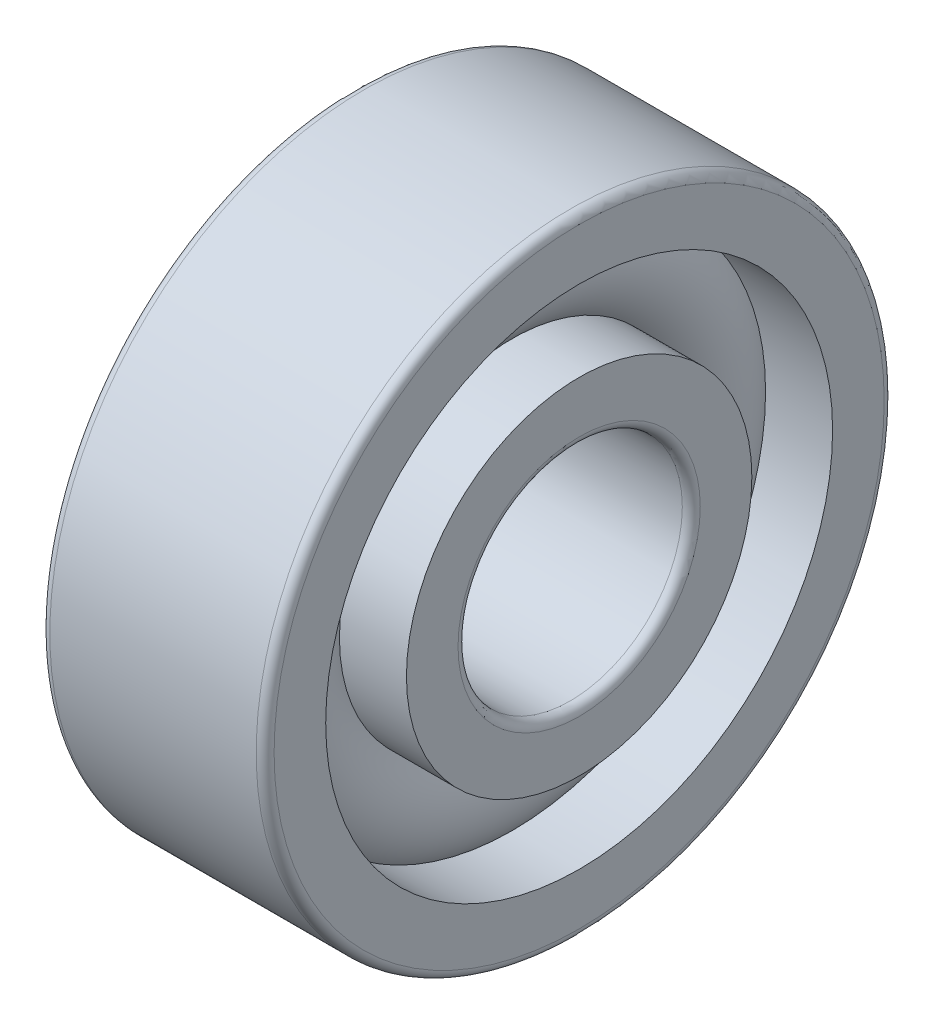
ISO-10303-21;
HEADER;
FILE_DESCRIPTION(('STEP AP214'),'2;1');
FILE_NAME('part.step','',(''),(''),'','','');
FILE_SCHEMA(('AUTOMOTIVE_DESIGN { 1 0 10303 214 1 1 1 1 }'));
ENDSEC;
DATA;
#1=APPLICATION_CONTEXT('core data for automotive mechanical design processes');
#2=APPLICATION_PROTOCOL_DEFINITION('international standard','automotive_design',2000,#1);
#3=PRODUCT_CONTEXT('',#1,'mechanical');
#4=PRODUCT('Part','Part','',(#3));
#5=PRODUCT_RELATED_PRODUCT_CATEGORY('part','',(#4));
#6=PRODUCT_DEFINITION_FORMATION('','',#4);
#7=PRODUCT_DEFINITION_CONTEXT('part definition',#1,'design');
#8=PRODUCT_DEFINITION('design','',#6,#7);
#9=PRODUCT_DEFINITION_SHAPE('','',#8);
#10=(LENGTH_UNIT() NAMED_UNIT(*) SI_UNIT(.MILLI.,.METRE.));
#11=(NAMED_UNIT(*) PLANE_ANGLE_UNIT() SI_UNIT($,.RADIAN.));
#12=(NAMED_UNIT(*) SI_UNIT($,.STERADIAN.) SOLID_ANGLE_UNIT());
#13=UNCERTAINTY_MEASURE_WITH_UNIT(LENGTH_MEASURE(1.E-05),#10,'distance_accuracy_value','');
#14=(GEOMETRIC_REPRESENTATION_CONTEXT(3) GLOBAL_UNCERTAINTY_ASSIGNED_CONTEXT((#13)) GLOBAL_UNIT_ASSIGNED_CONTEXT((#10,
#11,#12)) REPRESENTATION_CONTEXT('',''));
#15=CARTESIAN_POINT('',(0.,0.,0.));
#16=DIRECTION('',(0.,0.,1.));
#17=DIRECTION('',(1.,0.,0.));
#18=AXIS2_PLACEMENT_3D('',#15,#16,#17);
#19=CARTESIAN_POINT('',(0.,0.,0.));
#20=DIRECTION('',(-1.,0.,0.));
#21=DIRECTION('',(0.,0.,1.));
#22=AXIS2_PLACEMENT_3D('',#19,#20,#21);
#23=TOROIDAL_SURFACE('',#22,4.75,1.35);
#24=CARTESIAN_POINT('',(1.0062305898749,0.,0.));
#25=DIRECTION('',(-1.,0.,0.));
#26=DIRECTION('',(0.,0.,1.));
#27=AXIS2_PLACEMENT_3D('',#24,#25,#26);
#28=CIRCLE('',#27,5.65000000000001);
#29=CARTESIAN_POINT('',(1.0062305898749,0.,5.65000000000001));
#30=VERTEX_POINT('',#29);
#31=EDGE_CURVE('E35',#30,#30,#28,.F.);
#32=ORIENTED_EDGE('',*,*,#31,.T.);
#33=EDGE_LOOP('',(#32));
#34=FACE_BOUND('',#33,.T.);
#35=CARTESIAN_POINT('',(1.00623058987491,0.,0.));
#36=DIRECTION('',(-1.,0.,0.));
#37=DIRECTION('',(0.,0.,1.));
#38=AXIS2_PLACEMENT_3D('',#35,#36,#37);
#39=CIRCLE('',#38,3.85);
#40=CARTESIAN_POINT('',(1.00623058987491,0.,3.85));
#41=VERTEX_POINT('',#40);
#42=EDGE_CURVE('E10',#41,#41,#39,.T.);
#43=ORIENTED_EDGE('',*,*,#42,.T.);
#44=EDGE_LOOP('',(#43));
#45=FACE_BOUND('',#44,.T.);
#46=ADVANCED_FACE('F31',(#34,#45),#23,.T.);
#47=CARTESIAN_POINT('',(-20.6375,0.,0.));
#48=DIRECTION('',(1.,0.,0.));
#49=DIRECTION('',(0.,0.,-1.));
#50=AXIS2_PLACEMENT_3D('',#47,#48,#49);
#51=CYLINDRICAL_SURFACE('',#50,3.85);
#52=CARTESIAN_POINT('',(2.5,0.,0.));
#53=DIRECTION('',(1.,0.,0.));
#54=DIRECTION('',(0.,0.,-1.));
#55=AXIS2_PLACEMENT_3D('',#52,#53,#54);
#56=CIRCLE('',#55,3.85);
#57=CARTESIAN_POINT('',(2.5,0.,-3.85));
#58=VERTEX_POINT('',#57);
#59=EDGE_CURVE('E44',#58,#58,#56,.T.);
#60=ORIENTED_EDGE('',*,*,#59,.F.);
#61=EDGE_LOOP('',(#60));
#62=FACE_BOUND('',#61,.T.);
#63=ORIENTED_EDGE('',*,*,#42,.F.);
#64=EDGE_LOOP('',(#63));
#65=FACE_BOUND('',#64,.T.);
#66=ADVANCED_FACE('F83',(#62,#65),#51,.T.);
#67=CARTESIAN_POINT('',(-20.6375,0.,0.));
#68=DIRECTION('',(1.,0.,0.));
#69=DIRECTION('',(0.,0.,-1.));
#70=AXIS2_PLACEMENT_3D('',#67,#68,#69);
#71=CYLINDRICAL_SURFACE('',#70,3.85);
#72=CARTESIAN_POINT('',(-2.5,0.,0.));
#73=DIRECTION('',(1.,0.,0.));
#74=DIRECTION('',(0.,0.,-1.));
#75=AXIS2_PLACEMENT_3D('',#72,#73,#74);
#76=CIRCLE('',#75,3.85);
#77=CARTESIAN_POINT('',(-2.5,0.,-3.85));
#78=VERTEX_POINT('',#77);
#79=EDGE_CURVE('E53',#78,#78,#76,.T.);
#80=ORIENTED_EDGE('',*,*,#79,.T.);
#81=EDGE_LOOP('',(#80));
#82=FACE_BOUND('',#81,.T.);
#83=CARTESIAN_POINT('',(-1.00623058987491,0.,0.));
#84=DIRECTION('',(1.,0.,0.));
#85=DIRECTION('',(0.,0.,-1.));
#86=AXIS2_PLACEMENT_3D('',#83,#84,#85);
#87=CIRCLE('',#86,3.85);
#88=CARTESIAN_POINT('',(-1.00623058987491,0.,-3.85));
#89=VERTEX_POINT('',#88);
#90=EDGE_CURVE('E39',#89,#89,#87,.T.);
#91=ORIENTED_EDGE('',*,*,#90,.F.);
#92=EDGE_LOOP('',(#91));
#93=FACE_BOUND('',#92,.T.);
#94=ADVANCED_FACE('F86',(#82,#93),#71,.T.);
#95=CARTESIAN_POINT('',(2.5,2.7,0.));
#96=DIRECTION('',(1.,0.,0.));
#97=DIRECTION('',(0.,0.,-1.));
#98=AXIS2_PLACEMENT_3D('',#95,#96,#97);
#99=PLANE('',#98);
#100=ORIENTED_EDGE('',*,*,#59,.T.);
#101=EDGE_LOOP('',(#100));
#102=FACE_BOUND('',#101,.T.);
#103=CARTESIAN_POINT('',(2.5,0.,0.));
#104=DIRECTION('',(1.,0.,0.));
#105=DIRECTION('',(0.,0.,-1.));
#106=AXIS2_PLACEMENT_3D('',#103,#104,#105);
#107=CIRCLE('',#106,2.7);
#108=CARTESIAN_POINT('',(2.5,0.,-2.7));
#109=VERTEX_POINT('',#108);
#110=EDGE_CURVE('E75',#109,#109,#107,.T.);
#111=ORIENTED_EDGE('',*,*,#110,.F.);
#112=EDGE_LOOP('',(#111));
#113=FACE_BOUND('',#112,.T.);
#114=ADVANCED_FACE('F80',(#102,#113),#99,.T.);
#115=CARTESIAN_POINT('',(2.3,0.,0.));
#116=DIRECTION('',(1.,0.,0.));
#117=DIRECTION('',(0.,0.,-1.));
#118=AXIS2_PLACEMENT_3D('',#115,#116,#117);
#119=TOROIDAL_SURFACE('',#118,2.7,0.199999999999999);
#120=ORIENTED_EDGE('',*,*,#110,.T.);
#121=EDGE_LOOP('',(#120));
#122=FACE_BOUND('',#121,.T.);
#123=CARTESIAN_POINT('',(2.3,0.,0.));
#124=DIRECTION('',(1.,0.,0.));
#125=DIRECTION('',(0.,0.,-1.));
#126=AXIS2_PLACEMENT_3D('',#123,#124,#125);
#127=CIRCLE('',#126,2.5);
#128=CARTESIAN_POINT('',(2.3,0.,-2.5));
#129=VERTEX_POINT('',#128);
#130=EDGE_CURVE('E72',#129,#129,#127,.T.);
#131=ORIENTED_EDGE('',*,*,#130,.F.);
#132=EDGE_LOOP('',(#131));
#133=FACE_BOUND('',#132,.T.);
#134=ADVANCED_FACE('F97',(#122,#133),#119,.T.);
#135=CARTESIAN_POINT('',(-20.6375,0.,0.));
#136=DIRECTION('',(1.,0.,0.));
#137=DIRECTION('',(0.,0.,-1.));
#138=AXIS2_PLACEMENT_3D('',#135,#136,#137);
#139=CYLINDRICAL_SURFACE('',#138,2.5);
#140=ORIENTED_EDGE('',*,*,#130,.T.);
#141=EDGE_LOOP('',(#140));
#142=FACE_BOUND('',#141,.T.);
#143=CARTESIAN_POINT('',(-2.3,0.,0.));
#144=DIRECTION('',(1.,0.,0.));
#145=DIRECTION('',(0.,0.,-1.));
#146=AXIS2_PLACEMENT_3D('',#143,#144,#145);
#147=CIRCLE('',#146,2.5);
#148=CARTESIAN_POINT('',(-2.3,0.,-2.5));
#149=VERTEX_POINT('',#148);
#150=EDGE_CURVE('E69',#149,#149,#147,.T.);
#151=ORIENTED_EDGE('',*,*,#150,.F.);
#152=EDGE_LOOP('',(#151));
#153=FACE_BOUND('',#152,.T.);
#154=ADVANCED_FACE('F100',(#142,#153),#139,.F.);
#155=CARTESIAN_POINT('',(-2.3,0.,0.));
#156=DIRECTION('',(1.,0.,0.));
#157=DIRECTION('',(0.,0.,-1.));
#158=AXIS2_PLACEMENT_3D('',#155,#156,#157);
#159=TOROIDAL_SURFACE('',#158,2.7,0.199999999999999);
#160=ORIENTED_EDGE('',*,*,#150,.T.);
#161=EDGE_LOOP('',(#160));
#162=FACE_BOUND('',#161,.T.);
#163=CARTESIAN_POINT('',(-2.5,0.,0.));
#164=DIRECTION('',(1.,0.,0.));
#165=DIRECTION('',(0.,0.,-1.));
#166=AXIS2_PLACEMENT_3D('',#163,#164,#165);
#167=CIRCLE('',#166,2.7);
#168=CARTESIAN_POINT('',(-2.5,0.,-2.7));
#169=VERTEX_POINT('',#168);
#170=EDGE_CURVE('E66',#169,#169,#167,.T.);
#171=ORIENTED_EDGE('',*,*,#170,.F.);
#172=EDGE_LOOP('',(#171));
#173=FACE_BOUND('',#172,.T.);
#174=ADVANCED_FACE('F104',(#162,#173),#159,.T.);
#175=CARTESIAN_POINT('',(-2.5,3.85,0.));
#176=DIRECTION('',(-1.,0.,0.));
#177=DIRECTION('',(0.,0.,1.));
#178=AXIS2_PLACEMENT_3D('',#175,#176,#177);
#179=PLANE('',#178);
#180=ORIENTED_EDGE('',*,*,#170,.T.);
#181=EDGE_LOOP('',(#180));
#182=FACE_BOUND('',#181,.T.);
#183=ORIENTED_EDGE('',*,*,#79,.F.);
#184=EDGE_LOOP('',(#183));
#185=FACE_BOUND('',#184,.T.);
#186=ADVANCED_FACE('F108',(#182,#185),#179,.T.);
#187=CARTESIAN_POINT('',(-1.0062305898749,0.,0.));
#188=DIRECTION('',(1.,0.,0.));
#189=DIRECTION('',(0.,0.,-1.));
#190=AXIS2_PLACEMENT_3D('',#187,#188,#189);
#191=CIRCLE('',#190,5.65000000000001);
#192=CARTESIAN_POINT('',(-1.0062305898749,0.,-5.65000000000001));
#193=VERTEX_POINT('',#192);
#194=EDGE_CURVE('E47',#193,#193,#191,.F.);
#195=ORIENTED_EDGE('',*,*,#194,.T.);
#196=EDGE_LOOP('',(#195));
#197=FACE_BOUND('',#196,.T.);
#198=ORIENTED_EDGE('',*,*,#90,.T.);
#199=EDGE_LOOP('',(#198));
#200=FACE_BOUND('',#199,.T.);
#201=ADVANCED_FACE('F33',(#197,#200),#23,.T.);
#202=CARTESIAN_POINT('',(-20.6375,0.,0.));
#203=DIRECTION('',(1.,0.,0.));
#204=DIRECTION('',(0.,0.,-1.));
#205=AXIS2_PLACEMENT_3D('',#202,#203,#204);
#206=CYLINDRICAL_SURFACE('',#205,5.65000000000001);
#207=CARTESIAN_POINT('',(2.5,0.,0.));
#208=DIRECTION('',(1.,0.,0.));
#209=DIRECTION('',(0.,0.,-1.));
#210=AXIS2_PLACEMENT_3D('',#207,#208,#209);
#211=CIRCLE('',#210,5.65000000000001);
#212=CARTESIAN_POINT('',(2.5,0.,-5.65000000000001));
#213=VERTEX_POINT('',#212);
#214=EDGE_CURVE('E49',#213,#213,#211,.T.);
#215=ORIENTED_EDGE('',*,*,#214,.T.);
#216=EDGE_LOOP('',(#215));
#217=FACE_BOUND('',#216,.T.);
#218=ORIENTED_EDGE('',*,*,#31,.F.);
#219=EDGE_LOOP('',(#218));
#220=FACE_BOUND('',#219,.T.);
#221=ADVANCED_FACE('F113',(#217,#220),#206,.F.);
#222=CARTESIAN_POINT('',(-20.6375,0.,0.));
#223=DIRECTION('',(1.,0.,0.));
#224=DIRECTION('',(0.,0.,-1.));
#225=AXIS2_PLACEMENT_3D('',#222,#223,#224);
#226=CYLINDRICAL_SURFACE('',#225,5.65000000000001);
#227=CARTESIAN_POINT('',(-2.5,0.,0.));
#228=DIRECTION('',(1.,0.,0.));
#229=DIRECTION('',(0.,0.,-1.));
#230=AXIS2_PLACEMENT_3D('',#227,#228,#229);
#231=CIRCLE('',#230,5.65000000000001);
#232=CARTESIAN_POINT('',(-2.5,0.,-5.65000000000001));
#233=VERTEX_POINT('',#232);
#234=EDGE_CURVE('E144',#233,#233,#231,.T.);
#235=ORIENTED_EDGE('',*,*,#234,.F.);
#236=EDGE_LOOP('',(#235));
#237=FACE_BOUND('',#236,.T.);
#238=ORIENTED_EDGE('',*,*,#194,.F.);
#239=EDGE_LOOP('',(#238));
#240=FACE_BOUND('',#239,.T.);
#241=ADVANCED_FACE('F116',(#237,#240),#226,.F.);
#242=CARTESIAN_POINT('',(2.5,6.80000000000001,0.));
#243=DIRECTION('',(1.,0.,0.));
#244=DIRECTION('',(0.,0.,-1.));
#245=AXIS2_PLACEMENT_3D('',#242,#243,#244);
#246=PLANE('',#245);
#247=CARTESIAN_POINT('',(2.5,0.,0.));
#248=DIRECTION('',(1.,0.,0.));
#249=DIRECTION('',(0.,0.,-1.));
#250=AXIS2_PLACEMENT_3D('',#247,#248,#249);
#251=CIRCLE('',#250,6.80000000000001);
#252=CARTESIAN_POINT('',(2.5,0.,-6.80000000000001));
#253=VERTEX_POINT('',#252);
#254=EDGE_CURVE('E55',#253,#253,#251,.T.);
#255=ORIENTED_EDGE('',*,*,#254,.T.);
#256=EDGE_LOOP('',(#255));
#257=FACE_BOUND('',#256,.T.);
#258=ORIENTED_EDGE('',*,*,#214,.F.);
#259=EDGE_LOOP('',(#258));
#260=FACE_BOUND('',#259,.T.);
#261=ADVANCED_FACE('F117',(#257,#260),#246,.T.);
#262=CARTESIAN_POINT('',(2.3,0.,0.));
#263=DIRECTION('',(1.,0.,0.));
#264=DIRECTION('',(0.,0.,-1.));
#265=AXIS2_PLACEMENT_3D('',#262,#263,#264);
#266=TOROIDAL_SURFACE('',#265,6.80000000000001,0.2);
#267=CARTESIAN_POINT('',(2.3,0.,0.));
#268=DIRECTION('',(1.,0.,0.));
#269=DIRECTION('',(0.,0.,-1.));
#270=AXIS2_PLACEMENT_3D('',#267,#268,#269);
#271=CIRCLE('',#270,7.00000000000001);
#272=CARTESIAN_POINT('',(2.3,0.,-7.00000000000001));
#273=VERTEX_POINT('',#272);
#274=EDGE_CURVE('E60',#273,#273,#271,.T.);
#275=ORIENTED_EDGE('',*,*,#274,.T.);
#276=EDGE_LOOP('',(#275));
#277=FACE_BOUND('',#276,.T.);
#278=ORIENTED_EDGE('',*,*,#254,.F.);
#279=EDGE_LOOP('',(#278));
#280=FACE_BOUND('',#279,.T.);
#281=ADVANCED_FACE('F120',(#277,#280),#266,.T.);
#282=CARTESIAN_POINT('',(-20.6375,0.,0.));
#283=DIRECTION('',(1.,0.,0.));
#284=DIRECTION('',(0.,0.,-1.));
#285=AXIS2_PLACEMENT_3D('',#282,#283,#284);
#286=CYLINDRICAL_SURFACE('',#285,7.00000000000001);
#287=CARTESIAN_POINT('',(-2.3,0.,0.));
#288=DIRECTION('',(1.,0.,0.));
#289=DIRECTION('',(0.,0.,-1.));
#290=AXIS2_PLACEMENT_3D('',#287,#288,#289);
#291=CIRCLE('',#290,7.00000000000001);
#292=CARTESIAN_POINT('',(-2.3,0.,-7.00000000000001));
#293=VERTEX_POINT('',#292);
#294=EDGE_CURVE('E148',#293,#293,#291,.T.);
#295=ORIENTED_EDGE('',*,*,#294,.T.);
#296=EDGE_LOOP('',(#295));
#297=FACE_BOUND('',#296,.T.);
#298=ORIENTED_EDGE('',*,*,#274,.F.);
#299=EDGE_LOOP('',(#298));
#300=FACE_BOUND('',#299,.T.);
#301=ADVANCED_FACE('F124',(#297,#300),#286,.T.);
#302=CARTESIAN_POINT('',(-2.3,0.,0.));
#303=DIRECTION('',(1.,0.,0.));
#304=DIRECTION('',(0.,0.,-1.));
#305=AXIS2_PLACEMENT_3D('',#302,#303,#304);
#306=TOROIDAL_SURFACE('',#305,6.80000000000001,0.2);
#307=CARTESIAN_POINT('',(-2.5,0.,0.));
#308=DIRECTION('',(1.,0.,0.));
#309=DIRECTION('',(0.,0.,-1.));
#310=AXIS2_PLACEMENT_3D('',#307,#308,#309);
#311=CIRCLE('',#310,6.80000000000001);
#312=CARTESIAN_POINT('',(-2.5,0.,-6.80000000000001));
#313=VERTEX_POINT('',#312);
#314=EDGE_CURVE('E145',#313,#313,#311,.T.);
#315=ORIENTED_EDGE('',*,*,#314,.T.);
#316=EDGE_LOOP('',(#315));
#317=FACE_BOUND('',#316,.T.);
#318=ORIENTED_EDGE('',*,*,#294,.F.);
#319=EDGE_LOOP('',(#318));
#320=FACE_BOUND('',#319,.T.);
#321=ADVANCED_FACE('F128',(#317,#320),#306,.T.);
#322=CARTESIAN_POINT('',(-2.5,5.65000000000001,0.));
#323=DIRECTION('',(-1.,0.,0.));
#324=DIRECTION('',(0.,0.,1.));
#325=AXIS2_PLACEMENT_3D('',#322,#323,#324);
#326=PLANE('',#325);
#327=ORIENTED_EDGE('',*,*,#234,.T.);
#328=EDGE_LOOP('',(#327));
#329=FACE_BOUND('',#328,.T.);
#330=ORIENTED_EDGE('',*,*,#314,.F.);
#331=EDGE_LOOP('',(#330));
#332=FACE_BOUND('',#331,.T.);
#333=ADVANCED_FACE('F132',(#329,#332),#326,.T.);
#334=CLOSED_SHELL('',(#46,#66,#94,#114,#134,#154,#174,#186,#201,#221,#241,#261,#281,#301,#321,#333));
#335=MANIFOLD_SOLID_BREP('B2',#334);
#336=ADVANCED_BREP_SHAPE_REPRESENTATION('',(#18,#335),#14);
#337=SHAPE_DEFINITION_REPRESENTATION(#9,#336);
ENDSEC;
END-ISO-10303-21;
